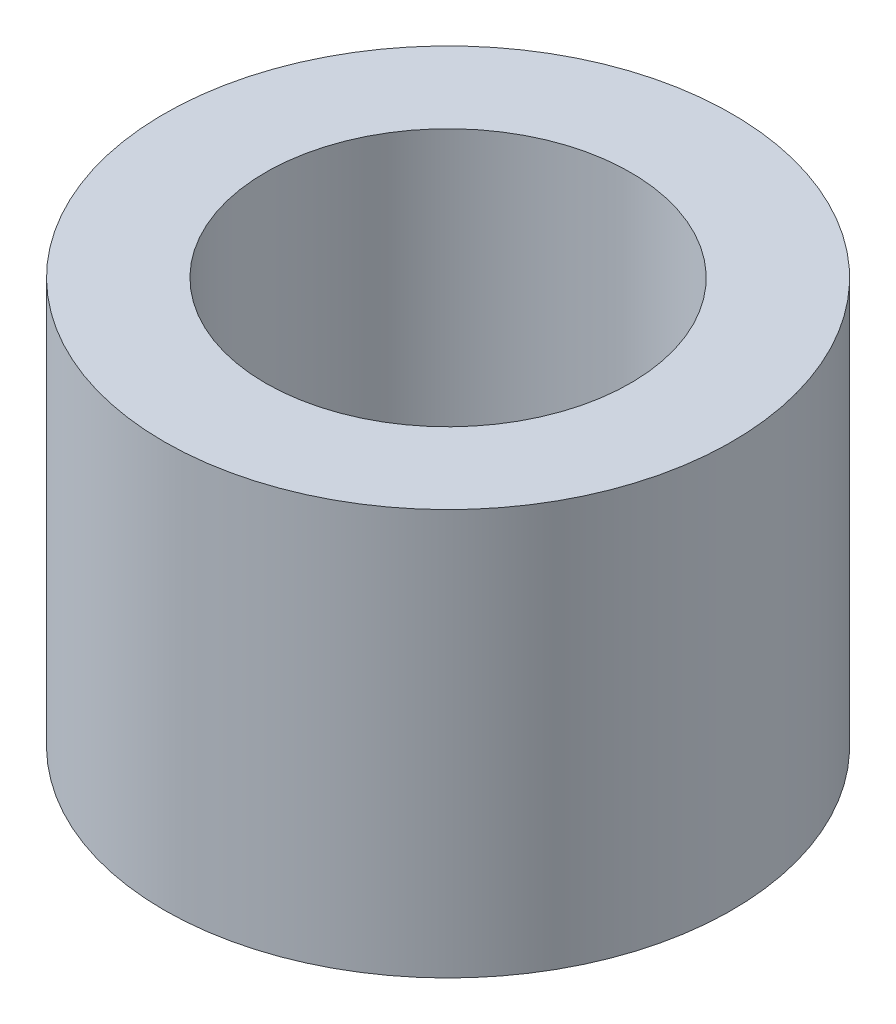
ISO-10303-21;
HEADER;
FILE_DESCRIPTION(('STEP AP214'),'2;1');
FILE_NAME('part.step','',(''),(''),'','','');
FILE_SCHEMA(('AUTOMOTIVE_DESIGN { 1 0 10303 214 1 1 1 1 }'));
ENDSEC;
DATA;
#1=APPLICATION_CONTEXT('core data for automotive mechanical design processes');
#2=APPLICATION_PROTOCOL_DEFINITION('international standard','automotive_design',2000,#1);
#3=PRODUCT_CONTEXT('',#1,'mechanical');
#4=PRODUCT('Part','Part','',(#3));
#5=PRODUCT_RELATED_PRODUCT_CATEGORY('part','',(#4));
#6=PRODUCT_DEFINITION_FORMATION('','',#4);
#7=PRODUCT_DEFINITION_CONTEXT('part definition',#1,'design');
#8=PRODUCT_DEFINITION('design','',#6,#7);
#9=PRODUCT_DEFINITION_SHAPE('','',#8);
#10=(LENGTH_UNIT() NAMED_UNIT(*) SI_UNIT(.MILLI.,.METRE.));
#11=(NAMED_UNIT(*) PLANE_ANGLE_UNIT() SI_UNIT($,.RADIAN.));
#12=(NAMED_UNIT(*) SI_UNIT($,.STERADIAN.) SOLID_ANGLE_UNIT());
#13=UNCERTAINTY_MEASURE_WITH_UNIT(LENGTH_MEASURE(1.E-05),#10,'distance_accuracy_value','');
#14=(GEOMETRIC_REPRESENTATION_CONTEXT(3) GLOBAL_UNCERTAINTY_ASSIGNED_CONTEXT((#13)) GLOBAL_UNIT_ASSIGNED_CONTEXT((#10,
#11,#12)) REPRESENTATION_CONTEXT('',''));
#15=CARTESIAN_POINT('',(0.,0.,0.));
#16=DIRECTION('',(0.,0.,1.));
#17=DIRECTION('',(1.,0.,0.));
#18=AXIS2_PLACEMENT_3D('',#15,#16,#17);
#19=CARTESIAN_POINT('',(0.,5.,0.));
#20=DIRECTION('',(0.,-1.,0.));
#21=DIRECTION('',(0.,0.,-1.));
#22=AXIS2_PLACEMENT_3D('',#19,#20,#21);
#23=CYLINDRICAL_SURFACE('',#22,3.5);
#24=CARTESIAN_POINT('',(0.,5.,0.));
#25=DIRECTION('',(0.,1.,0.));
#26=DIRECTION('',(0.,0.,1.));
#27=AXIS2_PLACEMENT_3D('',#24,#25,#26);
#28=CIRCLE('',#27,3.5);
#29=CARTESIAN_POINT('',(0.,5.,3.5));
#30=VERTEX_POINT('',#29);
#31=EDGE_CURVE('E10',#30,#30,#28,.T.);
#32=ORIENTED_EDGE('',*,*,#31,.F.);
#33=EDGE_LOOP('',(#32));
#34=FACE_BOUND('',#33,.T.);
#35=CARTESIAN_POINT('',(0.,0.,0.));
#36=DIRECTION('',(0.,1.,0.));
#37=DIRECTION('',(0.,0.,1.));
#38=AXIS2_PLACEMENT_3D('',#35,#36,#37);
#39=CIRCLE('',#38,3.5);
#40=CARTESIAN_POINT('',(0.,0.,3.5));
#41=VERTEX_POINT('',#40);
#42=EDGE_CURVE('E40',#41,#41,#39,.T.);
#43=ORIENTED_EDGE('',*,*,#42,.T.);
#44=EDGE_LOOP('',(#43));
#45=FACE_BOUND('',#44,.T.);
#46=ADVANCED_FACE('F37',(#34,#45),#23,.T.);
#47=CARTESIAN_POINT('',(0.,5.,0.));
#48=DIRECTION('',(0.,1.,0.));
#49=DIRECTION('',(0.,0.,1.));
#50=AXIS2_PLACEMENT_3D('',#47,#48,#49);
#51=PLANE('',#50);
#52=CARTESIAN_POINT('',(0.,5.,0.));
#53=DIRECTION('',(0.,1.,0.));
#54=DIRECTION('',(0.,0.,1.));
#55=AXIS2_PLACEMENT_3D('',#52,#53,#54);
#56=CIRCLE('',#55,2.25);
#57=CARTESIAN_POINT('',(0.,5.,2.25));
#58=VERTEX_POINT('',#57);
#59=EDGE_CURVE('E51',#58,#58,#56,.T.);
#60=ORIENTED_EDGE('',*,*,#59,.F.);
#61=EDGE_LOOP('',(#60));
#62=FACE_BOUND('',#61,.T.);
#63=ORIENTED_EDGE('',*,*,#31,.T.);
#64=EDGE_LOOP('',(#63));
#65=FACE_BOUND('',#64,.T.);
#66=ADVANCED_FACE('F68',(#62,#65),#51,.T.);
#67=CARTESIAN_POINT('',(0.,0.,0.));
#68=DIRECTION('',(0.,1.,0.));
#69=DIRECTION('',(0.,0.,1.));
#70=AXIS2_PLACEMENT_3D('',#67,#68,#69);
#71=PLANE('',#70);
#72=CARTESIAN_POINT('',(0.,0.,0.));
#73=DIRECTION('',(0.,1.,0.));
#74=DIRECTION('',(0.,0.,1.));
#75=AXIS2_PLACEMENT_3D('',#72,#73,#74);
#76=CIRCLE('',#75,2.25);
#77=CARTESIAN_POINT('',(0.,0.,2.25));
#78=VERTEX_POINT('',#77);
#79=EDGE_CURVE('E49',#78,#78,#76,.T.);
#80=ORIENTED_EDGE('',*,*,#79,.T.);
#81=EDGE_LOOP('',(#80));
#82=FACE_BOUND('',#81,.T.);
#83=ORIENTED_EDGE('',*,*,#42,.F.);
#84=EDGE_LOOP('',(#83));
#85=FACE_BOUND('',#84,.T.);
#86=ADVANCED_FACE('F59',(#82,#85),#71,.F.);
#87=CARTESIAN_POINT('',(0.,0.,0.));
#88=DIRECTION('',(0.,1.,0.));
#89=DIRECTION('',(0.,0.,1.));
#90=AXIS2_PLACEMENT_3D('',#87,#88,#89);
#91=CYLINDRICAL_SURFACE('',#90,2.25);
#92=ORIENTED_EDGE('',*,*,#79,.F.);
#93=EDGE_LOOP('',(#92));
#94=FACE_BOUND('',#93,.T.);
#95=ORIENTED_EDGE('',*,*,#59,.T.);
#96=EDGE_LOOP('',(#95));
#97=FACE_BOUND('',#96,.T.);
#98=ADVANCED_FACE('F62',(#94,#97),#91,.F.);
#99=CLOSED_SHELL('',(#46,#66,#86,#98));
#100=MANIFOLD_SOLID_BREP('B2',#99);
#101=ADVANCED_BREP_SHAPE_REPRESENTATION('',(#18,#100),#14);
#102=SHAPE_DEFINITION_REPRESENTATION(#9,#101);
ENDSEC;
END-ISO-10303-21;
